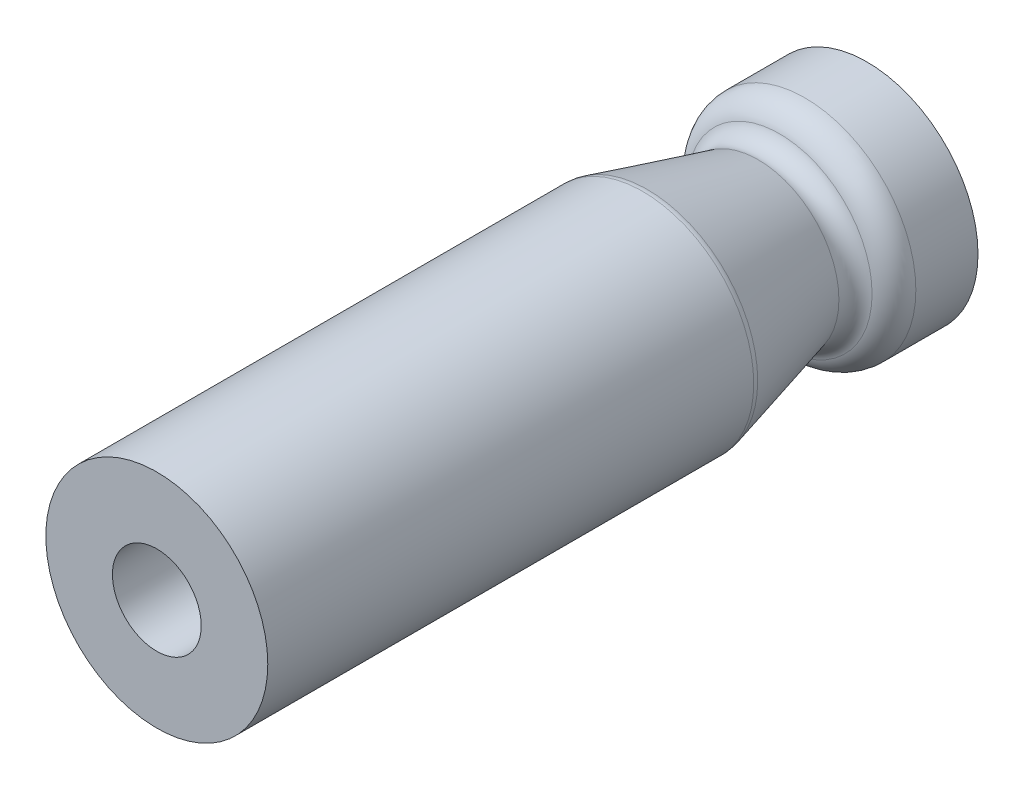
ISO-10303-21;
HEADER;
FILE_DESCRIPTION(('STEP AP214'),'2;1');
FILE_NAME('part.step','',(''),(''),'','','');
FILE_SCHEMA(('AUTOMOTIVE_DESIGN { 1 0 10303 214 1 1 1 1 }'));
ENDSEC;
DATA;
#1=APPLICATION_CONTEXT('core data for automotive mechanical design processes');
#2=APPLICATION_PROTOCOL_DEFINITION('international standard','automotive_design',2000,#1);
#3=PRODUCT_CONTEXT('',#1,'mechanical');
#4=PRODUCT('Part','Part','',(#3));
#5=PRODUCT_RELATED_PRODUCT_CATEGORY('part','',(#4));
#6=PRODUCT_DEFINITION_FORMATION('','',#4);
#7=PRODUCT_DEFINITION_CONTEXT('part definition',#1,'design');
#8=PRODUCT_DEFINITION('design','',#6,#7);
#9=PRODUCT_DEFINITION_SHAPE('','',#8);
#10=(LENGTH_UNIT() NAMED_UNIT(*) SI_UNIT(.MILLI.,.METRE.));
#11=(NAMED_UNIT(*) PLANE_ANGLE_UNIT() SI_UNIT($,.RADIAN.));
#12=(NAMED_UNIT(*) SI_UNIT($,.STERADIAN.) SOLID_ANGLE_UNIT());
#13=UNCERTAINTY_MEASURE_WITH_UNIT(LENGTH_MEASURE(1.E-05),#10,'distance_accuracy_value','');
#14=(GEOMETRIC_REPRESENTATION_CONTEXT(3) GLOBAL_UNCERTAINTY_ASSIGNED_CONTEXT((#13)) GLOBAL_UNIT_ASSIGNED_CONTEXT((#10,
#11,#12)) REPRESENTATION_CONTEXT('',''));
#15=CARTESIAN_POINT('',(0.,0.,0.));
#16=DIRECTION('',(0.,0.,1.));
#17=DIRECTION('',(1.,0.,0.));
#18=AXIS2_PLACEMENT_3D('',#15,#16,#17);
#19=CARTESIAN_POINT('',(0.,0.,80.));
#20=DIRECTION('',(0.,0.,-1.));
#21=DIRECTION('',(-1.,0.,0.));
#22=AXIS2_PLACEMENT_3D('',#19,#20,#21);
#23=CYLINDRICAL_SURFACE('',#22,12.5);
#24=CARTESIAN_POINT('',(0.,0.,7.00000000000001));
#25=DIRECTION('',(0.,0.,1.));
#26=DIRECTION('',(1.,0.,0.));
#27=AXIS2_PLACEMENT_3D('',#24,#25,#26);
#28=CIRCLE('',#27,12.5);
#29=CARTESIAN_POINT('',(12.5,0.,7.00000000000001));
#30=VERTEX_POINT('',#29);
#31=EDGE_CURVE('E59',#30,#30,#28,.F.);
#32=ORIENTED_EDGE('',*,*,#31,.T.);
#33=EDGE_LOOP('',(#32));
#34=FACE_BOUND('',#33,.T.);
#35=CARTESIAN_POINT('',(0.,0.,0.));
#36=DIRECTION('',(0.,0.,1.));
#37=DIRECTION('',(1.,0.,0.));
#38=AXIS2_PLACEMENT_3D('',#35,#36,#37);
#39=CIRCLE('',#38,12.5);
#40=CARTESIAN_POINT('',(12.5,0.,0.));
#41=VERTEX_POINT('',#40);
#42=EDGE_CURVE('E63',#41,#41,#39,.T.);
#43=ORIENTED_EDGE('',*,*,#42,.T.);
#44=EDGE_LOOP('',(#43));
#45=FACE_BOUND('',#44,.T.);
#46=ADVANCED_FACE('F39',(#34,#45),#23,.T.);
#47=CARTESIAN_POINT('',(0.,0.,25.26208734813));
#48=DIRECTION('',(0.,0.,1.));
#49=DIRECTION('',(1.,0.,0.));
#50=AXIS2_PLACEMENT_3D('',#47,#48,#49);
#51=CIRCLE('',#50,12.5);
#52=CARTESIAN_POINT('',(12.5,0.,25.26208734813));
#53=VERTEX_POINT('',#52);
#54=EDGE_CURVE('E11',#53,#53,#51,.T.);
#55=ORIENTED_EDGE('',*,*,#54,.T.);
#56=EDGE_LOOP('',(#55));
#57=FACE_BOUND('',#56,.T.);
#58=CARTESIAN_POINT('',(0.,0.,80.));
#59=DIRECTION('',(0.,0.,1.));
#60=DIRECTION('',(1.,0.,0.));
#61=AXIS2_PLACEMENT_3D('',#58,#59,#60);
#62=CIRCLE('',#61,12.5);
#63=CARTESIAN_POINT('',(12.5,0.,80.));
#64=VERTEX_POINT('',#63);
#65=EDGE_CURVE('E62',#64,#64,#62,.T.);
#66=ORIENTED_EDGE('',*,*,#65,.F.);
#67=EDGE_LOOP('',(#66));
#68=FACE_BOUND('',#67,.T.);
#69=ADVANCED_FACE('F81',(#57,#68),#23,.T.);
#70=CARTESIAN_POINT('',(0.,0.,80.));
#71=DIRECTION('',(0.,0.,1.));
#72=DIRECTION('',(1.,0.,0.));
#73=AXIS2_PLACEMENT_3D('',#70,#71,#72);
#74=PLANE('',#73);
#75=ORIENTED_EDGE('',*,*,#65,.T.);
#76=EDGE_LOOP('',(#75));
#77=FACE_BOUND('',#76,.T.);
#78=CARTESIAN_POINT('',(0.,0.,80.));
#79=DIRECTION('',(0.,0.,1.));
#80=DIRECTION('',(1.,0.,0.));
#81=AXIS2_PLACEMENT_3D('',#78,#79,#80);
#82=CIRCLE('',#81,5.);
#83=CARTESIAN_POINT('',(5.,0.,80.));
#84=VERTEX_POINT('',#83);
#85=EDGE_CURVE('E66',#84,#84,#82,.T.);
#86=ORIENTED_EDGE('',*,*,#85,.F.);
#87=EDGE_LOOP('',(#86));
#88=FACE_BOUND('',#87,.T.);
#89=ADVANCED_FACE('F78',(#77,#88),#74,.T.);
#90=CARTESIAN_POINT('',(0.,0.,0.));
#91=DIRECTION('',(0.,0.,1.));
#92=DIRECTION('',(1.,0.,0.));
#93=AXIS2_PLACEMENT_3D('',#90,#91,#92);
#94=PLANE('',#93);
#95=ORIENTED_EDGE('',*,*,#42,.F.);
#96=EDGE_LOOP('',(#95));
#97=FACE_BOUND('',#96,.T.);
#98=CARTESIAN_POINT('',(0.,0.,0.));
#99=DIRECTION('',(0.,0.,1.));
#100=DIRECTION('',(1.,0.,0.));
#101=AXIS2_PLACEMENT_3D('',#98,#99,#100);
#102=CIRCLE('',#101,5.);
#103=CARTESIAN_POINT('',(5.,0.,0.));
#104=VERTEX_POINT('',#103);
#105=EDGE_CURVE('E69',#104,#104,#102,.T.);
#106=ORIENTED_EDGE('',*,*,#105,.T.);
#107=EDGE_LOOP('',(#106));
#108=FACE_BOUND('',#107,.T.);
#109=ADVANCED_FACE('F80',(#97,#108),#94,.F.);
#110=CARTESIAN_POINT('',(0.,0.,80.));
#111=DIRECTION('',(0.,0.,-1.));
#112=DIRECTION('',(-1.,0.,0.));
#113=AXIS2_PLACEMENT_3D('',#110,#111,#112);
#114=CYLINDRICAL_SURFACE('',#113,5.);
#115=ORIENTED_EDGE('',*,*,#85,.T.);
#116=EDGE_LOOP('',(#115));
#117=FACE_BOUND('',#116,.T.);
#118=ORIENTED_EDGE('',*,*,#105,.F.);
#119=EDGE_LOOP('',(#118));
#120=FACE_BOUND('',#119,.T.);
#121=ADVANCED_FACE('F75',(#117,#120),#114,.F.);
#122=CARTESIAN_POINT('',(0.,0.,10.));
#123=DIRECTION('',(0.,0.,1.));
#124=DIRECTION('',(1.,0.,0.));
#125=AXIS2_PLACEMENT_3D('',#122,#123,#124);
#126=CONICAL_SURFACE('',#125,8.5,0.260602391747341);
#127=CARTESIAN_POINT('',(0.,0.,24.7467620470094));
#128=DIRECTION('',(0.,0.,1.));
#129=DIRECTION('',(1.,0.,0.));
#130=AXIS2_PLACEMENT_3D('',#127,#128,#129);
#131=CIRCLE('',#130,12.4324698792025);
#132=CARTESIAN_POINT('',(12.4324698792025,0.,24.7467620470094));
#133=VERTEX_POINT('',#132);
#134=EDGE_CURVE('E46',#133,#133,#131,.F.);
#135=ORIENTED_EDGE('',*,*,#134,.T.);
#136=EDGE_LOOP('',(#135));
#137=FACE_BOUND('',#136,.T.);
#138=CARTESIAN_POINT('',(0.,0.,12.2727321517519));
#139=DIRECTION('',(0.,0.,1.));
#140=DIRECTION('',(1.,0.,0.));
#141=AXIS2_PLACEMENT_3D('',#138,#139,#140);
#142=CIRCLE('',#141,9.10606190713383);
#143=CARTESIAN_POINT('',(9.10606190713383,0.,12.2727321517519));
#144=VERTEX_POINT('',#143);
#145=EDGE_CURVE('E50',#144,#144,#142,.T.);
#146=ORIENTED_EDGE('',*,*,#145,.T.);
#147=EDGE_LOOP('',(#146));
#148=FACE_BOUND('',#147,.T.);
#149=ADVANCED_FACE('F101',(#137,#148),#126,.T.);
#150=CARTESIAN_POINT('',(0.,0.,7.00000000000001));
#151=DIRECTION('',(0.,0.,1.));
#152=DIRECTION('',(1.,0.,0.));
#153=AXIS2_PLACEMENT_3D('',#150,#151,#152);
#154=TOROIDAL_SURFACE('',#153,9.5,3.);
#155=CARTESIAN_POINT('',(0.,0.,9.85444411037871));
#156=DIRECTION('',(0.,0.,-1.));
#157=DIRECTION('',(-1.,0.,0.));
#158=AXIS2_PLACEMENT_3D('',#155,#156,#157);
#159=CIRCLE('',#158,10.4231190718018);
#160=CARTESIAN_POINT('',(-10.4231190718018,0.,9.85444411037871));
#161=VERTEX_POINT('',#160);
#162=EDGE_CURVE('E54',#161,#161,#159,.T.);
#163=ORIENTED_EDGE('',*,*,#162,.T.);
#164=EDGE_LOOP('',(#163));
#165=FACE_BOUND('',#164,.T.);
#166=ORIENTED_EDGE('',*,*,#31,.F.);
#167=EDGE_LOOP('',(#166));
#168=FACE_BOUND('',#167,.T.);
#169=ADVANCED_FACE('F98',(#165,#168),#154,.T.);
#170=CARTESIAN_POINT('',(0.,0.,11.7574068506312));
#171=DIRECTION('',(0.,0.,-1.));
#172=DIRECTION('',(-1.,0.,0.));
#173=AXIS2_PLACEMENT_3D('',#170,#171,#172);
#174=TOROIDAL_SURFACE('',#173,11.0385317863363,2.);
#175=ORIENTED_EDGE('',*,*,#145,.F.);
#176=EDGE_LOOP('',(#175));
#177=FACE_BOUND('',#176,.T.);
#178=ORIENTED_EDGE('',*,*,#162,.F.);
#179=EDGE_LOOP('',(#178));
#180=FACE_BOUND('',#179,.T.);
#181=ADVANCED_FACE('F100',(#177,#180),#174,.F.);
#182=CARTESIAN_POINT('',(0.,0.,25.26208734813));
#183=DIRECTION('',(0.,0.,1.));
#184=DIRECTION('',(1.,0.,0.));
#185=AXIS2_PLACEMENT_3D('',#182,#183,#184);
#186=TOROIDAL_SURFACE('',#185,10.5,2.);
#187=ORIENTED_EDGE('',*,*,#54,.F.);
#188=EDGE_LOOP('',(#187));
#189=FACE_BOUND('',#188,.T.);
#190=ORIENTED_EDGE('',*,*,#134,.F.);
#191=EDGE_LOOP('',(#190));
#192=FACE_BOUND('',#191,.T.);
#193=ADVANCED_FACE('F41',(#189,#192),#186,.T.);
#194=CLOSED_SHELL('',(#46,#69,#89,#109,#121,#149,#169,#181,#193));
#195=MANIFOLD_SOLID_BREP('B2',#194);
#196=ADVANCED_BREP_SHAPE_REPRESENTATION('',(#18,#195),#14);
#197=SHAPE_DEFINITION_REPRESENTATION(#9,#196);
ENDSEC;
END-ISO-10303-21;
